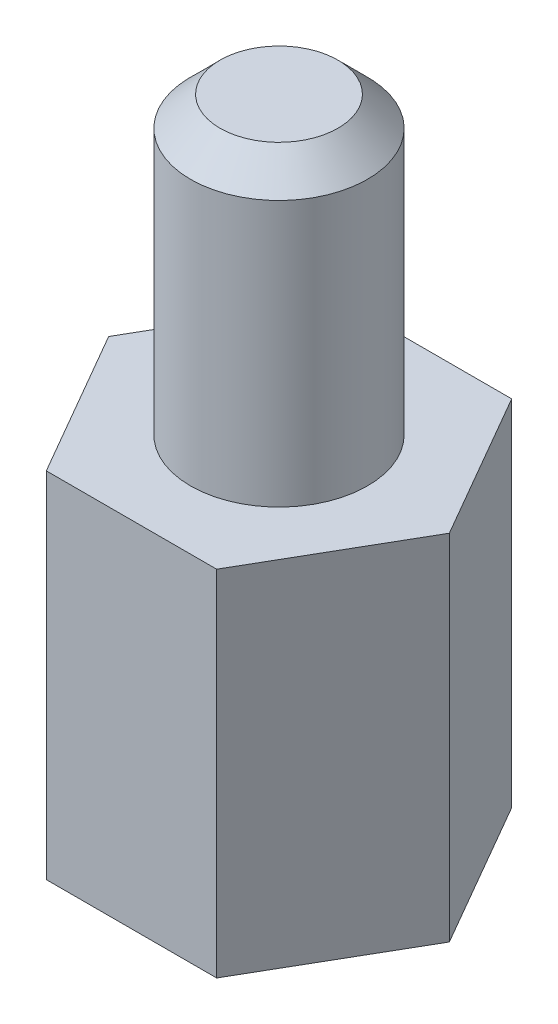
ISO-10303-21;
HEADER;
FILE_DESCRIPTION(('STEP AP214'),'2;1');
FILE_NAME('part.step','',(''),(''),'','','');
FILE_SCHEMA(('AUTOMOTIVE_DESIGN { 1 0 10303 214 1 1 1 1 }'));
ENDSEC;
DATA;
#1=APPLICATION_CONTEXT('core data for automotive mechanical design processes');
#2=APPLICATION_PROTOCOL_DEFINITION('international standard','automotive_design',2000,#1);
#3=PRODUCT_CONTEXT('',#1,'mechanical');
#4=PRODUCT('Part','Part','',(#3));
#5=PRODUCT_RELATED_PRODUCT_CATEGORY('part','',(#4));
#6=PRODUCT_DEFINITION_FORMATION('','',#4);
#7=PRODUCT_DEFINITION_CONTEXT('part definition',#1,'design');
#8=PRODUCT_DEFINITION('design','',#6,#7);
#9=PRODUCT_DEFINITION_SHAPE('','',#8);
#10=(LENGTH_UNIT() NAMED_UNIT(*) SI_UNIT(.MILLI.,.METRE.));
#11=(NAMED_UNIT(*) PLANE_ANGLE_UNIT() SI_UNIT($,.RADIAN.));
#12=(NAMED_UNIT(*) SI_UNIT($,.STERADIAN.) SOLID_ANGLE_UNIT());
#13=UNCERTAINTY_MEASURE_WITH_UNIT(LENGTH_MEASURE(1.E-05),#10,'distance_accuracy_value','');
#14=(GEOMETRIC_REPRESENTATION_CONTEXT(3) GLOBAL_UNCERTAINTY_ASSIGNED_CONTEXT((#13)) GLOBAL_UNIT_ASSIGNED_CONTEXT((#10,
#11,#12)) REPRESENTATION_CONTEXT('',''));
#15=CARTESIAN_POINT('',(0.,0.,0.));
#16=DIRECTION('',(0.,0.,1.));
#17=DIRECTION('',(1.,0.,0.));
#18=AXIS2_PLACEMENT_3D('',#15,#16,#17);
#19=CARTESIAN_POINT('',(-1.44337567297407,6.,2.5));
#20=DIRECTION('',(0.,0.,-1.));
#21=DIRECTION('',(-1.,0.,0.));
#22=AXIS2_PLACEMENT_3D('',#19,#20,#21);
#23=PLANE('',#22);
#24=DIRECTION('',(1.,0.,0.));
#25=VECTOR('',#24,1.);
#26=CARTESIAN_POINT('',(-1.44337567297407,0.,2.5));
#27=LINE('',#26,#25);
#28=CARTESIAN_POINT('',(-1.44337567297407,0.,2.5));
#29=VERTEX_POINT('',#28);
#30=CARTESIAN_POINT('',(1.44337567297406,0.,2.5));
#31=VERTEX_POINT('',#30);
#32=EDGE_CURVE('E123',#29,#31,#27,.T.);
#33=ORIENTED_EDGE('',*,*,#32,.T.);
#34=DIRECTION('',(0.,-1.,0.));
#35=VECTOR('',#34,1.);
#36=CARTESIAN_POINT('',(1.44337567297406,6.,2.5));
#37=LINE('',#36,#35);
#38=CARTESIAN_POINT('',(1.44337567297406,6.,2.5));
#39=VERTEX_POINT('',#38);
#40=EDGE_CURVE('E141',#39,#31,#37,.T.);
#41=ORIENTED_EDGE('',*,*,#40,.F.);
#42=DIRECTION('',(1.,0.,0.));
#43=VECTOR('',#42,1.);
#44=CARTESIAN_POINT('',(-1.44337567297407,6.,2.5));
#45=LINE('',#44,#43);
#46=CARTESIAN_POINT('',(-1.44337567297407,6.,2.5));
#47=VERTEX_POINT('',#46);
#48=EDGE_CURVE('E134',#47,#39,#45,.T.);
#49=ORIENTED_EDGE('',*,*,#48,.F.);
#50=DIRECTION('',(0.,-1.,0.));
#51=VECTOR('',#50,1.);
#52=CARTESIAN_POINT('',(-1.44337567297407,6.,2.5));
#53=LINE('',#52,#51);
#54=EDGE_CURVE('E119',#47,#29,#53,.T.);
#55=ORIENTED_EDGE('',*,*,#54,.T.);
#56=EDGE_LOOP('',(#33,#41,#49,#55));
#57=FACE_BOUND('',#56,.T.);
#58=ADVANCED_FACE('F37',(#57),#23,.F.);
#59=CARTESIAN_POINT('',(1.44337567297406,6.,2.5));
#60=DIRECTION('',(-0.866025403784439,0.,-0.5));
#61=DIRECTION('',(-0.5,0.,0.866025403784439));
#62=AXIS2_PLACEMENT_3D('',#59,#60,#61);
#63=PLANE('',#62);
#64=DIRECTION('',(0.5,0.,-0.866025403784439));
#65=VECTOR('',#64,1.);
#66=CARTESIAN_POINT('',(1.44337567297406,0.,2.5));
#67=LINE('',#66,#65);
#68=CARTESIAN_POINT('',(2.88675134594813,0.,0.));
#69=VERTEX_POINT('',#68);
#70=EDGE_CURVE('E126',#31,#69,#67,.T.);
#71=ORIENTED_EDGE('',*,*,#70,.T.);
#72=DIRECTION('',(0.,-1.,0.));
#73=VECTOR('',#72,1.);
#74=CARTESIAN_POINT('',(2.88675134594813,6.,0.));
#75=LINE('',#74,#73);
#76=CARTESIAN_POINT('',(2.88675134594813,6.,0.));
#77=VERTEX_POINT('',#76);
#78=EDGE_CURVE('E138',#77,#69,#75,.T.);
#79=ORIENTED_EDGE('',*,*,#78,.F.);
#80=DIRECTION('',(0.5,0.,-0.866025403784439));
#81=VECTOR('',#80,1.);
#82=CARTESIAN_POINT('',(1.44337567297406,6.,2.5));
#83=LINE('',#82,#81);
#84=EDGE_CURVE('E92',#39,#77,#83,.T.);
#85=ORIENTED_EDGE('',*,*,#84,.F.);
#86=ORIENTED_EDGE('',*,*,#40,.T.);
#87=EDGE_LOOP('',(#71,#79,#85,#86));
#88=FACE_BOUND('',#87,.T.);
#89=ADVANCED_FACE('F162',(#88),#63,.F.);
#90=CARTESIAN_POINT('',(2.88675134594813,6.,0.));
#91=DIRECTION('',(-0.866025403784439,0.,0.5));
#92=DIRECTION('',(0.5,0.,0.866025403784439));
#93=AXIS2_PLACEMENT_3D('',#90,#91,#92);
#94=PLANE('',#93);
#95=DIRECTION('',(-0.5,0.,-0.866025403784439));
#96=VECTOR('',#95,1.);
#97=CARTESIAN_POINT('',(2.88675134594813,0.,0.));
#98=LINE('',#97,#96);
#99=CARTESIAN_POINT('',(1.44337567297406,0.,-2.5));
#100=VERTEX_POINT('',#99);
#101=EDGE_CURVE('E129',#69,#100,#98,.T.);
#102=ORIENTED_EDGE('',*,*,#101,.T.);
#103=DIRECTION('',(0.,-1.,0.));
#104=VECTOR('',#103,1.);
#105=CARTESIAN_POINT('',(1.44337567297406,6.,-2.5));
#106=LINE('',#105,#104);
#107=CARTESIAN_POINT('',(1.44337567297406,6.,-2.5));
#108=VERTEX_POINT('',#107);
#109=EDGE_CURVE('E114',#108,#100,#106,.T.);
#110=ORIENTED_EDGE('',*,*,#109,.F.);
#111=DIRECTION('',(-0.5,0.,-0.866025403784439));
#112=VECTOR('',#111,1.);
#113=CARTESIAN_POINT('',(2.88675134594813,6.,0.));
#114=LINE('',#113,#112);
#115=EDGE_CURVE('E105',#77,#108,#114,.T.);
#116=ORIENTED_EDGE('',*,*,#115,.F.);
#117=ORIENTED_EDGE('',*,*,#78,.T.);
#118=EDGE_LOOP('',(#102,#110,#116,#117));
#119=FACE_BOUND('',#118,.T.);
#120=ADVANCED_FACE('F168',(#119),#94,.F.);
#121=CARTESIAN_POINT('',(1.44337567297406,6.,-2.5));
#122=DIRECTION('',(0.,0.,1.));
#123=DIRECTION('',(1.,0.,0.));
#124=AXIS2_PLACEMENT_3D('',#121,#122,#123);
#125=PLANE('',#124);
#126=DIRECTION('',(-1.,0.,0.));
#127=VECTOR('',#126,1.);
#128=CARTESIAN_POINT('',(1.44337567297406,0.,-2.5));
#129=LINE('',#128,#127);
#130=CARTESIAN_POINT('',(-1.44337567297407,0.,-2.5));
#131=VERTEX_POINT('',#130);
#132=EDGE_CURVE('E113',#100,#131,#129,.T.);
#133=ORIENTED_EDGE('',*,*,#132,.T.);
#134=DIRECTION('',(0.,-1.,0.));
#135=VECTOR('',#134,1.);
#136=CARTESIAN_POINT('',(-1.44337567297407,6.,-2.5));
#137=LINE('',#136,#135);
#138=CARTESIAN_POINT('',(-1.44337567297407,6.,-2.5));
#139=VERTEX_POINT('',#138);
#140=EDGE_CURVE('E110',#139,#131,#137,.T.);
#141=ORIENTED_EDGE('',*,*,#140,.F.);
#142=DIRECTION('',(-1.,0.,0.));
#143=VECTOR('',#142,1.);
#144=CARTESIAN_POINT('',(1.44337567297406,6.,-2.5));
#145=LINE('',#144,#143);
#146=EDGE_CURVE('E99',#108,#139,#145,.T.);
#147=ORIENTED_EDGE('',*,*,#146,.F.);
#148=ORIENTED_EDGE('',*,*,#109,.T.);
#149=EDGE_LOOP('',(#133,#141,#147,#148));
#150=FACE_BOUND('',#149,.T.);
#151=ADVANCED_FACE('F111',(#150),#125,.F.);
#152=CARTESIAN_POINT('',(-1.44337567297407,6.,-2.5));
#153=DIRECTION('',(0.866025403784439,0.,0.5));
#154=DIRECTION('',(0.5,0.,-0.866025403784439));
#155=AXIS2_PLACEMENT_3D('',#152,#153,#154);
#156=PLANE('',#155);
#157=DIRECTION('',(-0.5,0.,0.866025403784439));
#158=VECTOR('',#157,1.);
#159=CARTESIAN_POINT('',(-1.44337567297407,0.,-2.5));
#160=LINE('',#159,#158);
#161=CARTESIAN_POINT('',(-2.88675134594813,0.,0.));
#162=VERTEX_POINT('',#161);
#163=EDGE_CURVE('E77',#131,#162,#160,.T.);
#164=ORIENTED_EDGE('',*,*,#163,.T.);
#165=DIRECTION('',(0.,-1.,0.));
#166=VECTOR('',#165,1.);
#167=CARTESIAN_POINT('',(-2.88675134594813,6.,0.));
#168=LINE('',#167,#166);
#169=CARTESIAN_POINT('',(-2.88675134594813,6.,0.));
#170=VERTEX_POINT('',#169);
#171=EDGE_CURVE('E115',#170,#162,#168,.T.);
#172=ORIENTED_EDGE('',*,*,#171,.F.);
#173=DIRECTION('',(-0.5,0.,0.866025403784439));
#174=VECTOR('',#173,1.);
#175=CARTESIAN_POINT('',(-1.44337567297407,6.,-2.5));
#176=LINE('',#175,#174);
#177=EDGE_CURVE('E103',#139,#170,#176,.T.);
#178=ORIENTED_EDGE('',*,*,#177,.F.);
#179=ORIENTED_EDGE('',*,*,#140,.T.);
#180=EDGE_LOOP('',(#164,#172,#178,#179));
#181=FACE_BOUND('',#180,.T.);
#182=ADVANCED_FACE('F117',(#181),#156,.F.);
#183=CARTESIAN_POINT('',(-2.88675134594813,6.,0.));
#184=DIRECTION('',(0.866025403784439,0.,-0.5));
#185=DIRECTION('',(-0.5,0.,-0.866025403784439));
#186=AXIS2_PLACEMENT_3D('',#183,#184,#185);
#187=PLANE('',#186);
#188=DIRECTION('',(0.5,0.,0.866025403784439));
#189=VECTOR('',#188,1.);
#190=CARTESIAN_POINT('',(-2.88675134594813,0.,0.));
#191=LINE('',#190,#189);
#192=EDGE_CURVE('E83',#162,#29,#191,.T.);
#193=ORIENTED_EDGE('',*,*,#192,.T.);
#194=ORIENTED_EDGE('',*,*,#54,.F.);
#195=DIRECTION('',(0.5,0.,0.866025403784439));
#196=VECTOR('',#195,1.);
#197=CARTESIAN_POINT('',(-2.88675134594813,6.,0.));
#198=LINE('',#197,#196);
#199=EDGE_CURVE('E54',#170,#47,#198,.T.);
#200=ORIENTED_EDGE('',*,*,#199,.F.);
#201=ORIENTED_EDGE('',*,*,#171,.T.);
#202=EDGE_LOOP('',(#193,#194,#200,#201));
#203=FACE_BOUND('',#202,.T.);
#204=ADVANCED_FACE('F178',(#203),#187,.F.);
#205=CARTESIAN_POINT('',(0.,6.,0.));
#206=DIRECTION('',(0.,1.,0.));
#207=DIRECTION('',(0.,0.,1.));
#208=AXIS2_PLACEMENT_3D('',#205,#206,#207);
#209=PLANE('',#208);
#210=CARTESIAN_POINT('',(0.,6.,0.));
#211=DIRECTION('',(0.,1.,0.));
#212=DIRECTION('',(0.,0.,1.));
#213=AXIS2_PLACEMENT_3D('',#210,#211,#212);
#214=CIRCLE('',#213,1.5);
#215=CARTESIAN_POINT('',(0.,6.,1.5));
#216=VERTEX_POINT('',#215);
#217=EDGE_CURVE('E296',#216,#216,#214,.T.);
#218=ORIENTED_EDGE('',*,*,#217,.F.);
#219=EDGE_LOOP('',(#218));
#220=FACE_BOUND('',#219,.T.);
#221=ORIENTED_EDGE('',*,*,#48,.T.);
#222=ORIENTED_EDGE('',*,*,#84,.T.);
#223=ORIENTED_EDGE('',*,*,#115,.T.);
#224=ORIENTED_EDGE('',*,*,#146,.T.);
#225=ORIENTED_EDGE('',*,*,#177,.T.);
#226=ORIENTED_EDGE('',*,*,#199,.T.);
#227=EDGE_LOOP('',(#221,#222,#223,#224,#225,#226));
#228=FACE_BOUND('',#227,.T.);
#229=ADVANCED_FACE('F101',(#220,#228),#209,.T.);
#230=CARTESIAN_POINT('',(0.,0.,0.));
#231=DIRECTION('',(0.,1.,0.));
#232=DIRECTION('',(0.,0.,1.));
#233=AXIS2_PLACEMENT_3D('',#230,#231,#232);
#234=PLANE('',#233);
#235=CARTESIAN_POINT('',(0.,0.,0.));
#236=DIRECTION('',(0.,1.,0.));
#237=DIRECTION('',(0.,0.,1.));
#238=AXIS2_PLACEMENT_3D('',#235,#236,#237);
#239=CIRCLE('',#238,1.99999999999999);
#240=CARTESIAN_POINT('',(0.,0.,1.99999999999999));
#241=VERTEX_POINT('',#240);
#242=EDGE_CURVE('E146',#241,#241,#239,.T.);
#243=ORIENTED_EDGE('',*,*,#242,.T.);
#244=EDGE_LOOP('',(#243));
#245=FACE_BOUND('',#244,.T.);
#246=ORIENTED_EDGE('',*,*,#32,.F.);
#247=ORIENTED_EDGE('',*,*,#192,.F.);
#248=ORIENTED_EDGE('',*,*,#163,.F.);
#249=ORIENTED_EDGE('',*,*,#132,.F.);
#250=ORIENTED_EDGE('',*,*,#101,.F.);
#251=ORIENTED_EDGE('',*,*,#70,.F.);
#252=EDGE_LOOP('',(#246,#247,#248,#249,#250,#251));
#253=FACE_BOUND('',#252,.T.);
#254=ADVANCED_FACE('F181',(#245,#253),#234,.F.);
#255=CARTESIAN_POINT('',(0.,5.5,0.));
#256=DIRECTION('',(0.,-1.,0.));
#257=DIRECTION('',(0.,0.,-1.));
#258=AXIS2_PLACEMENT_3D('',#255,#256,#257);
#259=CONICAL_SURFACE('',#258,1.5,1.02974425867665);
#260=CARTESIAN_POINT('',(0.,6.,0.));
#261=DIRECTION('',(0.,1.,0.));
#262=DIRECTION('',(0.,0.,1.));
#263=AXIS2_PLACEMENT_3D('',#260,#261,#262);
#264=CIRCLE('',#263,0.66786025882474);
#265=CARTESIAN_POINT('',(0.,6.,0.66786025882474));
#266=VERTEX_POINT('',#265);
#267=EDGE_CURVE('E295',#266,#266,#264,.F.);
#268=ORIENTED_EDGE('',*,*,#267,.F.);
#269=EDGE_LOOP('',(#268));
#270=FACE_BOUND('',#269,.T.);
#271=CARTESIAN_POINT('',(0.,5.5,0.));
#272=DIRECTION('',(0.,-1.,0.));
#273=DIRECTION('',(0.,0.,-1.));
#274=AXIS2_PLACEMENT_3D('',#271,#272,#273);
#275=CIRCLE('',#274,1.5);
#276=CARTESIAN_POINT('',(0.,5.5,-1.5));
#277=VERTEX_POINT('',#276);
#278=EDGE_CURVE('E127',#277,#277,#275,.T.);
#279=ORIENTED_EDGE('',*,*,#278,.T.);
#280=EDGE_LOOP('',(#279));
#281=FACE_BOUND('',#280,.T.);
#282=ADVANCED_FACE('F184',(#270,#281),#259,.F.);
#283=CARTESIAN_POINT('',(0.,0.,0.));
#284=DIRECTION('',(0.,-1.,0.));
#285=DIRECTION('',(0.,0.,-1.));
#286=AXIS2_PLACEMENT_3D('',#283,#284,#285);
#287=CYLINDRICAL_SURFACE('',#286,1.49999999999999);
#288=CARTESIAN_POINT('',(0.,0.499999999999996,0.));
#289=DIRECTION('',(0.,1.,0.));
#290=DIRECTION('',(0.,0.,1.));
#291=AXIS2_PLACEMENT_3D('',#288,#289,#290);
#292=CIRCLE('',#291,1.49999999999999);
#293=CARTESIAN_POINT('',(0.,0.499999999999996,1.49999999999999));
#294=VERTEX_POINT('',#293);
#295=EDGE_CURVE('E143',#294,#294,#292,.F.);
#296=ORIENTED_EDGE('',*,*,#295,.T.);
#297=EDGE_LOOP('',(#296));
#298=FACE_BOUND('',#297,.T.);
#299=ORIENTED_EDGE('',*,*,#278,.F.);
#300=EDGE_LOOP('',(#299));
#301=FACE_BOUND('',#300,.T.);
#302=ADVANCED_FACE('F191',(#298,#301),#287,.F.);
#303=CARTESIAN_POINT('',(0.,6.,0.));
#304=DIRECTION('',(0.,1.,0.));
#305=DIRECTION('',(0.,0.,1.));
#306=AXIS2_PLACEMENT_3D('',#303,#304,#305);
#307=PLANE('',#306);
#308=ORIENTED_EDGE('',*,*,#267,.T.);
#309=EDGE_LOOP('',(#308));
#310=FACE_BOUND('',#309,.T.);
#311=ADVANCED_FACE('F195',(#310),#307,.F.);
#312=CARTESIAN_POINT('',(0.,11.,0.));
#313=DIRECTION('',(0.,-1.,0.));
#314=DIRECTION('',(0.,0.,-1.));
#315=AXIS2_PLACEMENT_3D('',#312,#313,#314);
#316=CYLINDRICAL_SURFACE('',#315,1.5);
#317=CARTESIAN_POINT('',(0.,10.5,0.));
#318=DIRECTION('',(0.,1.,0.));
#319=DIRECTION('',(0.,0.,1.));
#320=AXIS2_PLACEMENT_3D('',#317,#318,#319);
#321=CIRCLE('',#320,1.5);
#322=CARTESIAN_POINT('',(0.,10.5,1.5));
#323=VERTEX_POINT('',#322);
#324=EDGE_CURVE('E11',#323,#323,#321,.F.);
#325=ORIENTED_EDGE('',*,*,#324,.T.);
#326=EDGE_LOOP('',(#325));
#327=FACE_BOUND('',#326,.T.);
#328=ORIENTED_EDGE('',*,*,#217,.T.);
#329=EDGE_LOOP('',(#328));
#330=FACE_BOUND('',#329,.T.);
#331=ADVANCED_FACE('F197',(#327,#330),#316,.T.);
#332=CARTESIAN_POINT('',(0.,11.,0.));
#333=DIRECTION('',(0.,1.,0.));
#334=DIRECTION('',(0.,0.,1.));
#335=AXIS2_PLACEMENT_3D('',#332,#333,#334);
#336=PLANE('',#335);
#337=CARTESIAN_POINT('',(0.,11.,0.));
#338=DIRECTION('',(0.,1.,0.));
#339=DIRECTION('',(0.,0.,1.));
#340=AXIS2_PLACEMENT_3D('',#337,#338,#339);
#341=CIRCLE('',#340,1.);
#342=CARTESIAN_POINT('',(0.,11.,1.));
#343=VERTEX_POINT('',#342);
#344=EDGE_CURVE('E46',#343,#343,#341,.T.);
#345=ORIENTED_EDGE('',*,*,#344,.T.);
#346=EDGE_LOOP('',(#345));
#347=FACE_BOUND('',#346,.T.);
#348=ADVANCED_FACE('F151',(#347),#336,.T.);
#349=CARTESIAN_POINT('',(0.,0.499999999999996,0.));
#350=DIRECTION('',(0.,-1.,0.));
#351=DIRECTION('',(0.,0.,-1.));
#352=AXIS2_PLACEMENT_3D('',#349,#350,#351);
#353=CONICAL_SURFACE('',#352,1.49999999999999,0.78539816339745);
#354=ORIENTED_EDGE('',*,*,#242,.F.);
#355=EDGE_LOOP('',(#354));
#356=FACE_BOUND('',#355,.T.);
#357=ORIENTED_EDGE('',*,*,#295,.F.);
#358=EDGE_LOOP('',(#357));
#359=FACE_BOUND('',#358,.T.);
#360=ADVANCED_FACE('F154',(#356,#359),#353,.F.);
#361=CARTESIAN_POINT('',(0.,11.,0.));
#362=DIRECTION('',(0.,-1.,0.));
#363=DIRECTION('',(0.,0.,-1.));
#364=AXIS2_PLACEMENT_3D('',#361,#362,#363);
#365=CONICAL_SURFACE('',#364,1.,0.785398163397447);
#366=ORIENTED_EDGE('',*,*,#324,.F.);
#367=EDGE_LOOP('',(#366));
#368=FACE_BOUND('',#367,.T.);
#369=ORIENTED_EDGE('',*,*,#344,.F.);
#370=EDGE_LOOP('',(#369));
#371=FACE_BOUND('',#370,.T.);
#372=ADVANCED_FACE('F39',(#368,#371),#365,.T.);
#373=CLOSED_SHELL('',(#58,#89,#120,#151,#182,#204,#229,#254,#282,#302,#311,#331,#348,#360,#372));
#374=MANIFOLD_SOLID_BREP('B2',#373);
#375=ADVANCED_BREP_SHAPE_REPRESENTATION('',(#18,#374),#14);
#376=SHAPE_DEFINITION_REPRESENTATION(#9,#375);
ENDSEC;
END-ISO-10303-21;
